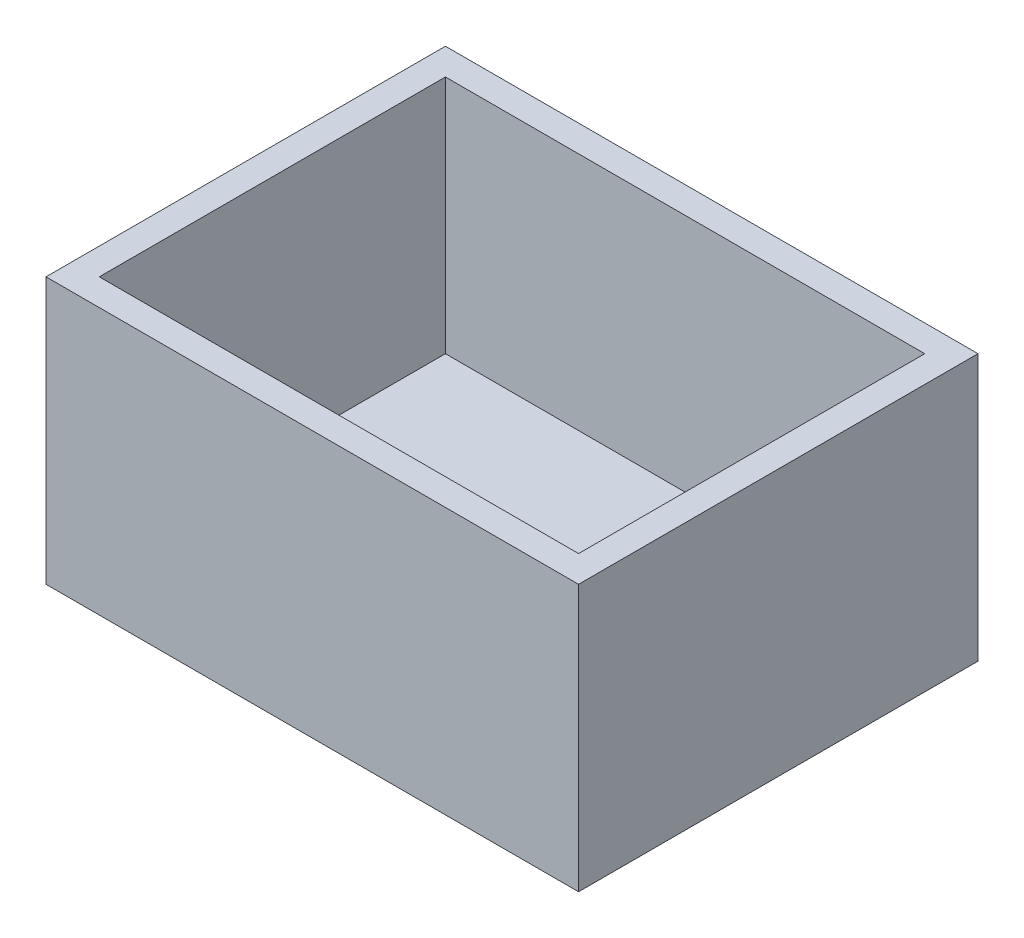
ISO-10303-21;
HEADER;
FILE_DESCRIPTION(('STEP AP214'),'2;1');
FILE_NAME('part.step','',(''),(''),'','','');
FILE_SCHEMA(('AUTOMOTIVE_DESIGN { 1 0 10303 214 1 1 1 1 }'));
ENDSEC;
DATA;
#1=APPLICATION_CONTEXT('core data for automotive mechanical design processes');
#2=APPLICATION_PROTOCOL_DEFINITION('international standard','automotive_design',2000,#1);
#3=PRODUCT_CONTEXT('',#1,'mechanical');
#4=PRODUCT('Part','Part','',(#3));
#5=PRODUCT_RELATED_PRODUCT_CATEGORY('part','',(#4));
#6=PRODUCT_DEFINITION_FORMATION('','',#4);
#7=PRODUCT_DEFINITION_CONTEXT('part definition',#1,'design');
#8=PRODUCT_DEFINITION('design','',#6,#7);
#9=PRODUCT_DEFINITION_SHAPE('','',#8);
#10=(LENGTH_UNIT() NAMED_UNIT(*) SI_UNIT(.MILLI.,.METRE.));
#11=(NAMED_UNIT(*) PLANE_ANGLE_UNIT() SI_UNIT($,.RADIAN.));
#12=(NAMED_UNIT(*) SI_UNIT($,.STERADIAN.) SOLID_ANGLE_UNIT());
#13=UNCERTAINTY_MEASURE_WITH_UNIT(LENGTH_MEASURE(1.E-05),#10,'distance_accuracy_value','');
#14=(GEOMETRIC_REPRESENTATION_CONTEXT(3) GLOBAL_UNCERTAINTY_ASSIGNED_CONTEXT((#13)) GLOBAL_UNIT_ASSIGNED_CONTEXT((#10,
#11,#12)) REPRESENTATION_CONTEXT('',''));
#15=CARTESIAN_POINT('',(0.,0.,0.));
#16=DIRECTION('',(0.,0.,1.));
#17=DIRECTION('',(1.,0.,0.));
#18=AXIS2_PLACEMENT_3D('',#15,#16,#17);
#19=CARTESIAN_POINT('',(-20.,20.,-15.));
#20=DIRECTION('',(1.,0.,0.));
#21=DIRECTION('',(0.,0.,-1.));
#22=AXIS2_PLACEMENT_3D('',#19,#20,#21);
#23=PLANE('',#22);
#24=DIRECTION('',(0.,0.,1.));
#25=VECTOR('',#24,1.);
#26=CARTESIAN_POINT('',(-20.,0.,-15.));
#27=LINE('',#26,#25);
#28=CARTESIAN_POINT('',(-20.,0.,-15.));
#29=VERTEX_POINT('',#28);
#30=CARTESIAN_POINT('',(-20.,0.,15.));
#31=VERTEX_POINT('',#30);
#32=EDGE_CURVE('E155',#29,#31,#27,.T.);
#33=ORIENTED_EDGE('',*,*,#32,.T.);
#34=DIRECTION('',(0.,-1.,0.));
#35=VECTOR('',#34,1.);
#36=CARTESIAN_POINT('',(-20.,20.,15.));
#37=LINE('',#36,#35);
#38=CARTESIAN_POINT('',(-20.,20.,15.));
#39=VERTEX_POINT('',#38);
#40=EDGE_CURVE('E11',#39,#31,#37,.T.);
#41=ORIENTED_EDGE('',*,*,#40,.F.);
#42=DIRECTION('',(0.,0.,1.));
#43=VECTOR('',#42,1.);
#44=CARTESIAN_POINT('',(-20.,20.,-15.));
#45=LINE('',#44,#43);
#46=CARTESIAN_POINT('',(-20.,20.,-15.));
#47=VERTEX_POINT('',#46);
#48=EDGE_CURVE('E148',#47,#39,#45,.T.);
#49=ORIENTED_EDGE('',*,*,#48,.F.);
#50=DIRECTION('',(0.,-1.,0.));
#51=VECTOR('',#50,1.);
#52=CARTESIAN_POINT('',(-20.,20.,-15.));
#53=LINE('',#52,#51);
#54=EDGE_CURVE('E154',#47,#29,#53,.T.);
#55=ORIENTED_EDGE('',*,*,#54,.T.);
#56=EDGE_LOOP('',(#33,#41,#49,#55));
#57=FACE_BOUND('',#56,.T.);
#58=ADVANCED_FACE('F41',(#57),#23,.F.);
#59=CARTESIAN_POINT('',(-20.,20.,15.));
#60=DIRECTION('',(0.,0.,-1.));
#61=DIRECTION('',(-1.,0.,0.));
#62=AXIS2_PLACEMENT_3D('',#59,#60,#61);
#63=PLANE('',#62);
#64=DIRECTION('',(1.,0.,0.));
#65=VECTOR('',#64,1.);
#66=CARTESIAN_POINT('',(-20.,0.,15.));
#67=LINE('',#66,#65);
#68=CARTESIAN_POINT('',(20.,0.,15.));
#69=VERTEX_POINT('',#68);
#70=EDGE_CURVE('E158',#31,#69,#67,.T.);
#71=ORIENTED_EDGE('',*,*,#70,.T.);
#72=DIRECTION('',(0.,-1.,0.));
#73=VECTOR('',#72,1.);
#74=CARTESIAN_POINT('',(20.,20.,15.));
#75=LINE('',#74,#73);
#76=CARTESIAN_POINT('',(20.,20.,15.));
#77=VERTEX_POINT('',#76);
#78=EDGE_CURVE('E48',#77,#69,#75,.T.);
#79=ORIENTED_EDGE('',*,*,#78,.F.);
#80=DIRECTION('',(1.,0.,0.));
#81=VECTOR('',#80,1.);
#82=CARTESIAN_POINT('',(-20.,20.,15.));
#83=LINE('',#82,#81);
#84=EDGE_CURVE('E92',#39,#77,#83,.T.);
#85=ORIENTED_EDGE('',*,*,#84,.F.);
#86=ORIENTED_EDGE('',*,*,#40,.T.);
#87=EDGE_LOOP('',(#71,#79,#85,#86));
#88=FACE_BOUND('',#87,.T.);
#89=ADVANCED_FACE('F188',(#88),#63,.F.);
#90=CARTESIAN_POINT('',(20.,20.,15.));
#91=DIRECTION('',(-1.,0.,0.));
#92=DIRECTION('',(0.,0.,1.));
#93=AXIS2_PLACEMENT_3D('',#90,#91,#92);
#94=PLANE('',#93);
#95=DIRECTION('',(0.,0.,-1.));
#96=VECTOR('',#95,1.);
#97=CARTESIAN_POINT('',(20.,0.,15.));
#98=LINE('',#97,#96);
#99=CARTESIAN_POINT('',(20.,0.,-15.));
#100=VERTEX_POINT('',#99);
#101=EDGE_CURVE('E160',#69,#100,#98,.T.);
#102=ORIENTED_EDGE('',*,*,#101,.T.);
#103=DIRECTION('',(0.,-1.,0.));
#104=VECTOR('',#103,1.);
#105=CARTESIAN_POINT('',(20.,20.,-15.));
#106=LINE('',#105,#104);
#107=CARTESIAN_POINT('',(20.,20.,-15.));
#108=VERTEX_POINT('',#107);
#109=EDGE_CURVE('E164',#108,#100,#106,.T.);
#110=ORIENTED_EDGE('',*,*,#109,.F.);
#111=DIRECTION('',(0.,0.,-1.));
#112=VECTOR('',#111,1.);
#113=CARTESIAN_POINT('',(20.,20.,15.));
#114=LINE('',#113,#112);
#115=EDGE_CURVE('E151',#77,#108,#114,.T.);
#116=ORIENTED_EDGE('',*,*,#115,.F.);
#117=ORIENTED_EDGE('',*,*,#78,.T.);
#118=EDGE_LOOP('',(#102,#110,#116,#117));
#119=FACE_BOUND('',#118,.T.);
#120=ADVANCED_FACE('F169',(#119),#94,.F.);
#121=CARTESIAN_POINT('',(20.,20.,-15.));
#122=DIRECTION('',(0.,0.,1.));
#123=DIRECTION('',(1.,0.,0.));
#124=AXIS2_PLACEMENT_3D('',#121,#122,#123);
#125=PLANE('',#124);
#126=DIRECTION('',(-1.,0.,0.));
#127=VECTOR('',#126,1.);
#128=CARTESIAN_POINT('',(20.,0.,-15.));
#129=LINE('',#128,#127);
#130=EDGE_CURVE('E85',#100,#29,#129,.T.);
#131=ORIENTED_EDGE('',*,*,#130,.T.);
#132=ORIENTED_EDGE('',*,*,#54,.F.);
#133=DIRECTION('',(-1.,0.,0.));
#134=VECTOR('',#133,1.);
#135=CARTESIAN_POINT('',(20.,20.,-15.));
#136=LINE('',#135,#134);
#137=EDGE_CURVE('E64',#108,#47,#136,.T.);
#138=ORIENTED_EDGE('',*,*,#137,.F.);
#139=ORIENTED_EDGE('',*,*,#109,.T.);
#140=EDGE_LOOP('',(#131,#132,#138,#139));
#141=FACE_BOUND('',#140,.T.);
#142=ADVANCED_FACE('F177',(#141),#125,.F.);
#143=CARTESIAN_POINT('',(0.,20.,0.));
#144=DIRECTION('',(0.,1.,0.));
#145=DIRECTION('',(0.,0.,1.));
#146=AXIS2_PLACEMENT_3D('',#143,#144,#145);
#147=PLANE('',#146);
#148=DIRECTION('',(0.,0.,1.));
#149=VECTOR('',#148,1.);
#150=CARTESIAN_POINT('',(-18.,20.,-15.));
#151=LINE('',#150,#149);
#152=CARTESIAN_POINT('',(-18.,20.,-13.));
#153=VERTEX_POINT('',#152);
#154=CARTESIAN_POINT('',(-18.,20.,13.));
#155=VERTEX_POINT('',#154);
#156=EDGE_CURVE('E137',#153,#155,#151,.T.);
#157=ORIENTED_EDGE('',*,*,#156,.F.);
#158=DIRECTION('',(-1.,0.,0.));
#159=VECTOR('',#158,1.);
#160=CARTESIAN_POINT('',(20.,20.,-13.));
#161=LINE('',#160,#159);
#162=CARTESIAN_POINT('',(18.,20.,-13.));
#163=VERTEX_POINT('',#162);
#164=EDGE_CURVE('E146',#163,#153,#161,.T.);
#165=ORIENTED_EDGE('',*,*,#164,.F.);
#166=DIRECTION('',(0.,0.,-1.));
#167=VECTOR('',#166,1.);
#168=CARTESIAN_POINT('',(18.,20.,15.));
#169=LINE('',#168,#167);
#170=CARTESIAN_POINT('',(18.,20.,13.));
#171=VERTEX_POINT('',#170);
#172=EDGE_CURVE('E144',#171,#163,#169,.T.);
#173=ORIENTED_EDGE('',*,*,#172,.F.);
#174=DIRECTION('',(1.,0.,0.));
#175=VECTOR('',#174,1.);
#176=CARTESIAN_POINT('',(-20.,20.,13.));
#177=LINE('',#176,#175);
#178=EDGE_CURVE('E129',#155,#171,#177,.T.);
#179=ORIENTED_EDGE('',*,*,#178,.F.);
#180=EDGE_LOOP('',(#157,#165,#173,#179));
#181=FACE_BOUND('',#180,.T.);
#182=ORIENTED_EDGE('',*,*,#48,.T.);
#183=ORIENTED_EDGE('',*,*,#84,.T.);
#184=ORIENTED_EDGE('',*,*,#115,.T.);
#185=ORIENTED_EDGE('',*,*,#137,.T.);
#186=EDGE_LOOP('',(#182,#183,#184,#185));
#187=FACE_BOUND('',#186,.T.);
#188=ADVANCED_FACE('F179',(#181,#187),#147,.T.);
#189=CARTESIAN_POINT('',(0.,0.,0.));
#190=DIRECTION('',(0.,1.,0.));
#191=DIRECTION('',(0.,0.,1.));
#192=AXIS2_PLACEMENT_3D('',#189,#190,#191);
#193=PLANE('',#192);
#194=ORIENTED_EDGE('',*,*,#32,.F.);
#195=ORIENTED_EDGE('',*,*,#130,.F.);
#196=ORIENTED_EDGE('',*,*,#101,.F.);
#197=ORIENTED_EDGE('',*,*,#70,.F.);
#198=EDGE_LOOP('',(#194,#195,#196,#197));
#199=FACE_BOUND('',#198,.T.);
#200=ADVANCED_FACE('F173',(#199),#193,.F.);
#201=CARTESIAN_POINT('',(-18.,20.,-15.));
#202=DIRECTION('',(1.,0.,0.));
#203=DIRECTION('',(0.,0.,-1.));
#204=AXIS2_PLACEMENT_3D('',#201,#202,#203);
#205=PLANE('',#204);
#206=DIRECTION('',(0.,0.,1.));
#207=VECTOR('',#206,1.);
#208=CARTESIAN_POINT('',(-18.,2.,-15.));
#209=LINE('',#208,#207);
#210=CARTESIAN_POINT('',(-18.,2.,-13.));
#211=VERTEX_POINT('',#210);
#212=CARTESIAN_POINT('',(-18.,2.,13.));
#213=VERTEX_POINT('',#212);
#214=EDGE_CURVE('E120',#211,#213,#209,.T.);
#215=ORIENTED_EDGE('',*,*,#214,.F.);
#216=DIRECTION('',(0.,-1.,0.));
#217=VECTOR('',#216,1.);
#218=CARTESIAN_POINT('',(-18.,20.,-13.));
#219=LINE('',#218,#217);
#220=EDGE_CURVE('E140',#153,#211,#219,.T.);
#221=ORIENTED_EDGE('',*,*,#220,.F.);
#222=ORIENTED_EDGE('',*,*,#156,.T.);
#223=DIRECTION('',(0.,-1.,0.));
#224=VECTOR('',#223,1.);
#225=CARTESIAN_POINT('',(-18.,20.,13.));
#226=LINE('',#225,#224);
#227=EDGE_CURVE('E132',#155,#213,#226,.T.);
#228=ORIENTED_EDGE('',*,*,#227,.T.);
#229=EDGE_LOOP('',(#215,#221,#222,#228));
#230=FACE_BOUND('',#229,.T.);
#231=ADVANCED_FACE('F222',(#230),#205,.T.);
#232=CARTESIAN_POINT('',(-20.,20.,13.));
#233=DIRECTION('',(0.,0.,-1.));
#234=DIRECTION('',(-1.,0.,0.));
#235=AXIS2_PLACEMENT_3D('',#232,#233,#234);
#236=PLANE('',#235);
#237=DIRECTION('',(1.,0.,0.));
#238=VECTOR('',#237,1.);
#239=CARTESIAN_POINT('',(-20.,2.,13.));
#240=LINE('',#239,#238);
#241=CARTESIAN_POINT('',(18.,2.,13.));
#242=VERTEX_POINT('',#241);
#243=EDGE_CURVE('E114',#213,#242,#240,.T.);
#244=ORIENTED_EDGE('',*,*,#243,.F.);
#245=ORIENTED_EDGE('',*,*,#227,.F.);
#246=ORIENTED_EDGE('',*,*,#178,.T.);
#247=DIRECTION('',(0.,-1.,0.));
#248=VECTOR('',#247,1.);
#249=CARTESIAN_POINT('',(18.,20.,13.));
#250=LINE('',#249,#248);
#251=EDGE_CURVE('E126',#171,#242,#250,.T.);
#252=ORIENTED_EDGE('',*,*,#251,.T.);
#253=EDGE_LOOP('',(#244,#245,#246,#252));
#254=FACE_BOUND('',#253,.T.);
#255=ADVANCED_FACE('F127',(#254),#236,.T.);
#256=CARTESIAN_POINT('',(18.,20.,15.));
#257=DIRECTION('',(-1.,0.,0.));
#258=DIRECTION('',(0.,0.,1.));
#259=AXIS2_PLACEMENT_3D('',#256,#257,#258);
#260=PLANE('',#259);
#261=DIRECTION('',(0.,0.,-1.));
#262=VECTOR('',#261,1.);
#263=CARTESIAN_POINT('',(18.,2.,15.));
#264=LINE('',#263,#262);
#265=CARTESIAN_POINT('',(18.,2.,-13.));
#266=VERTEX_POINT('',#265);
#267=EDGE_CURVE('E118',#242,#266,#264,.T.);
#268=ORIENTED_EDGE('',*,*,#267,.F.);
#269=ORIENTED_EDGE('',*,*,#251,.F.);
#270=ORIENTED_EDGE('',*,*,#172,.T.);
#271=DIRECTION('',(0.,-1.,0.));
#272=VECTOR('',#271,1.);
#273=CARTESIAN_POINT('',(18.,20.,-13.));
#274=LINE('',#273,#272);
#275=EDGE_CURVE('E55',#163,#266,#274,.T.);
#276=ORIENTED_EDGE('',*,*,#275,.T.);
#277=EDGE_LOOP('',(#268,#269,#270,#276));
#278=FACE_BOUND('',#277,.T.);
#279=ADVANCED_FACE('F134',(#278),#260,.T.);
#280=CARTESIAN_POINT('',(20.,20.,-13.));
#281=DIRECTION('',(0.,0.,1.));
#282=DIRECTION('',(1.,0.,0.));
#283=AXIS2_PLACEMENT_3D('',#280,#281,#282);
#284=PLANE('',#283);
#285=DIRECTION('',(-1.,0.,0.));
#286=VECTOR('',#285,1.);
#287=CARTESIAN_POINT('',(20.,2.,-13.));
#288=LINE('',#287,#286);
#289=EDGE_CURVE('E135',#266,#211,#288,.T.);
#290=ORIENTED_EDGE('',*,*,#289,.F.);
#291=ORIENTED_EDGE('',*,*,#275,.F.);
#292=ORIENTED_EDGE('',*,*,#164,.T.);
#293=ORIENTED_EDGE('',*,*,#220,.T.);
#294=EDGE_LOOP('',(#290,#291,#292,#293));
#295=FACE_BOUND('',#294,.T.);
#296=ADVANCED_FACE('F246',(#295),#284,.T.);
#297=CARTESIAN_POINT('',(0.,2.,0.));
#298=DIRECTION('',(0.,1.,0.));
#299=DIRECTION('',(0.,0.,1.));
#300=AXIS2_PLACEMENT_3D('',#297,#298,#299);
#301=PLANE('',#300);
#302=ORIENTED_EDGE('',*,*,#214,.T.);
#303=ORIENTED_EDGE('',*,*,#243,.T.);
#304=ORIENTED_EDGE('',*,*,#267,.T.);
#305=ORIENTED_EDGE('',*,*,#289,.T.);
#306=EDGE_LOOP('',(#302,#303,#304,#305));
#307=FACE_BOUND('',#306,.T.);
#308=ADVANCED_FACE('F116',(#307),#301,.T.);
#309=CLOSED_SHELL('',(#58,#89,#120,#142,#188,#200,#231,#255,#279,#296,#308));
#310=MANIFOLD_SOLID_BREP('B2',#309);
#311=ADVANCED_BREP_SHAPE_REPRESENTATION('',(#18,#310),#14);
#312=SHAPE_DEFINITION_REPRESENTATION(#9,#311);
ENDSEC;
END-ISO-10303-21;
